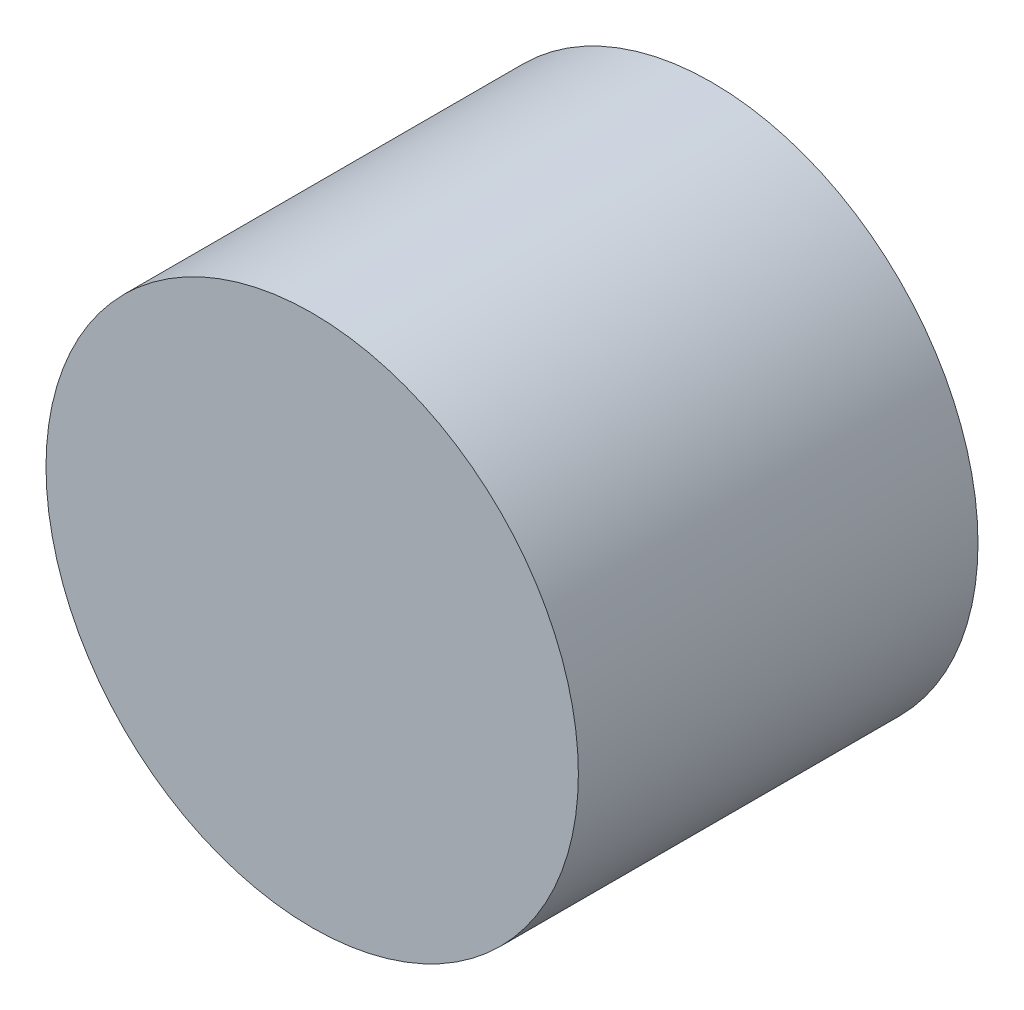
ISO-10303-21;
HEADER;
FILE_DESCRIPTION(('STEP AP214'),'2;1');
FILE_NAME('part.step','',(''),(''),'','','');
FILE_SCHEMA(('AUTOMOTIVE_DESIGN { 1 0 10303 214 1 1 1 1 }'));
ENDSEC;
DATA;
#1=APPLICATION_CONTEXT('core data for automotive mechanical design processes');
#2=APPLICATION_PROTOCOL_DEFINITION('international standard','automotive_design',2000,#1);
#3=PRODUCT_CONTEXT('',#1,'mechanical');
#4=PRODUCT('Part','Part','',(#3));
#5=PRODUCT_RELATED_PRODUCT_CATEGORY('part','',(#4));
#6=PRODUCT_DEFINITION_FORMATION('','',#4);
#7=PRODUCT_DEFINITION_CONTEXT('part definition',#1,'design');
#8=PRODUCT_DEFINITION('design','',#6,#7);
#9=PRODUCT_DEFINITION_SHAPE('','',#8);
#10=(LENGTH_UNIT() NAMED_UNIT(*) SI_UNIT(.MILLI.,.METRE.));
#11=(NAMED_UNIT(*) PLANE_ANGLE_UNIT() SI_UNIT($,.RADIAN.));
#12=(NAMED_UNIT(*) SI_UNIT($,.STERADIAN.) SOLID_ANGLE_UNIT());
#13=UNCERTAINTY_MEASURE_WITH_UNIT(LENGTH_MEASURE(1.E-05),#10,'distance_accuracy_value','');
#14=(GEOMETRIC_REPRESENTATION_CONTEXT(3) GLOBAL_UNCERTAINTY_ASSIGNED_CONTEXT((#13)) GLOBAL_UNIT_ASSIGNED_CONTEXT((#10,
#11,#12)) REPRESENTATION_CONTEXT('',''));
#15=CARTESIAN_POINT('',(0.,0.,0.));
#16=DIRECTION('',(0.,0.,1.));
#17=DIRECTION('',(1.,0.,0.));
#18=AXIS2_PLACEMENT_3D('',#15,#16,#17);
#19=CARTESIAN_POINT('',(-4.913,6.281,13.87722));
#20=DIRECTION('',(0.,0.,-1.));
#21=DIRECTION('',(-1.,0.,0.));
#22=AXIS2_PLACEMENT_3D('',#19,#20,#21);
#23=CYLINDRICAL_SURFACE('',#22,9.24319);
#24=CARTESIAN_POINT('',(-4.913,6.281,13.87722));
#25=DIRECTION('',(0.,0.,1.));
#26=DIRECTION('',(1.,0.,0.));
#27=AXIS2_PLACEMENT_3D('',#24,#25,#26);
#28=CIRCLE('',#27,9.24319);
#29=CARTESIAN_POINT('',(4.33019,6.281,13.87722));
#30=VERTEX_POINT('',#29);
#31=EDGE_CURVE('E10',#30,#30,#28,.T.);
#32=ORIENTED_EDGE('',*,*,#31,.F.);
#33=EDGE_LOOP('',(#32));
#34=FACE_BOUND('',#33,.T.);
#35=CARTESIAN_POINT('',(-4.913,6.281,0.));
#36=DIRECTION('',(0.,0.,1.));
#37=DIRECTION('',(1.,0.,0.));
#38=AXIS2_PLACEMENT_3D('',#35,#36,#37);
#39=CIRCLE('',#38,9.24319);
#40=CARTESIAN_POINT('',(4.33019,6.281,0.));
#41=VERTEX_POINT('',#40);
#42=EDGE_CURVE('E45',#41,#41,#39,.T.);
#43=ORIENTED_EDGE('',*,*,#42,.T.);
#44=EDGE_LOOP('',(#43));
#45=FACE_BOUND('',#44,.T.);
#46=ADVANCED_FACE('F39',(#34,#45),#23,.T.);
#47=CARTESIAN_POINT('',(-4.913,6.281,13.87722));
#48=DIRECTION('',(0.,0.,1.));
#49=DIRECTION('',(1.,0.,0.));
#50=AXIS2_PLACEMENT_3D('',#47,#48,#49);
#51=PLANE('',#50);
#52=ORIENTED_EDGE('',*,*,#31,.T.);
#53=EDGE_LOOP('',(#52));
#54=FACE_BOUND('',#53,.T.);
#55=ADVANCED_FACE('F53',(#54),#51,.T.);
#56=CARTESIAN_POINT('',(-4.913,6.281,0.));
#57=DIRECTION('',(0.,0.,1.));
#58=DIRECTION('',(1.,0.,0.));
#59=AXIS2_PLACEMENT_3D('',#56,#57,#58);
#60=PLANE('',#59);
#61=ORIENTED_EDGE('',*,*,#42,.F.);
#62=EDGE_LOOP('',(#61));
#63=FACE_BOUND('',#62,.T.);
#64=ADVANCED_FACE('F55',(#63),#60,.F.);
#65=CLOSED_SHELL('',(#46,#55,#64));
#66=MANIFOLD_SOLID_BREP('B2',#65);
#67=ADVANCED_BREP_SHAPE_REPRESENTATION('',(#18,#66),#14);
#68=SHAPE_DEFINITION_REPRESENTATION(#9,#67);
ENDSEC;
END-ISO-10303-21;
